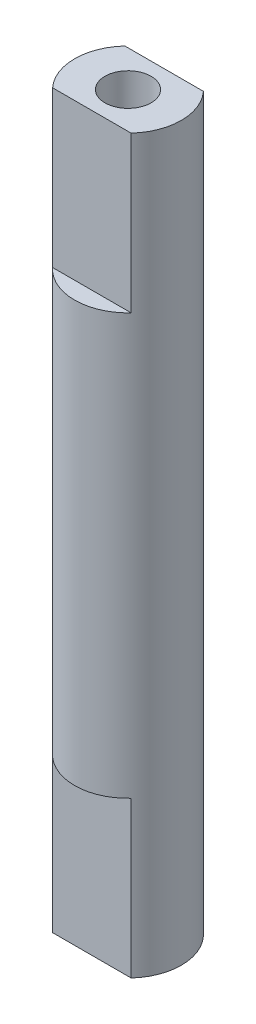
ISO-10303-21;
HEADER;
FILE_DESCRIPTION(('STEP AP214'),'2;1');
FILE_NAME('part.step','',(''),(''),'','','');
FILE_SCHEMA(('AUTOMOTIVE_DESIGN { 1 0 10303 214 1 1 1 1 }'));
ENDSEC;
DATA;
#1=APPLICATION_CONTEXT('core data for automotive mechanical design processes');
#2=APPLICATION_PROTOCOL_DEFINITION('international standard','automotive_design',2000,#1);
#3=PRODUCT_CONTEXT('',#1,'mechanical');
#4=PRODUCT('Part','Part','',(#3));
#5=PRODUCT_RELATED_PRODUCT_CATEGORY('part','',(#4));
#6=PRODUCT_DEFINITION_FORMATION('','',#4);
#7=PRODUCT_DEFINITION_CONTEXT('part definition',#1,'design');
#8=PRODUCT_DEFINITION('design','',#6,#7);
#9=PRODUCT_DEFINITION_SHAPE('','',#8);
#10=(LENGTH_UNIT() NAMED_UNIT(*) SI_UNIT(.MILLI.,.METRE.));
#11=(NAMED_UNIT(*) PLANE_ANGLE_UNIT() SI_UNIT($,.RADIAN.));
#12=(NAMED_UNIT(*) SI_UNIT($,.STERADIAN.) SOLID_ANGLE_UNIT());
#13=UNCERTAINTY_MEASURE_WITH_UNIT(LENGTH_MEASURE(1.E-05),#10,'distance_accuracy_value','');
#14=(GEOMETRIC_REPRESENTATION_CONTEXT(3) GLOBAL_UNCERTAINTY_ASSIGNED_CONTEXT((#13)) GLOBAL_UNIT_ASSIGNED_CONTEXT((#10,
#11,#12)) REPRESENTATION_CONTEXT('',''));
#15=CARTESIAN_POINT('',(0.,0.,0.));
#16=DIRECTION('',(0.,0.,1.));
#17=DIRECTION('',(1.,0.,0.));
#18=AXIS2_PLACEMENT_3D('',#15,#16,#17);
#19=CARTESIAN_POINT('',(0.,-12.75,0.));
#20=DIRECTION('',(0.,-1.,0.));
#21=DIRECTION('',(0.,0.,-1.));
#22=AXIS2_PLACEMENT_3D('',#19,#20,#21);
#23=PLANE('',#22);
#24=CARTESIAN_POINT('',(0.,-12.75,0.));
#25=DIRECTION('',(0.,1.,0.));
#26=DIRECTION('',(0.,0.,1.));
#27=AXIS2_PLACEMENT_3D('',#24,#25,#26);
#28=CIRCLE('',#27,1.18);
#29=CARTESIAN_POINT('',(0.,-12.75,1.18));
#30=VERTEX_POINT('',#29);
#31=EDGE_CURVE('E19',#30,#30,#28,.F.);
#32=ORIENTED_EDGE('',*,*,#31,.T.);
#33=EDGE_LOOP('',(#32));
#34=FACE_BOUND('',#33,.T.);
#35=ADVANCED_FACE('F16',(#34),#23,.T.);
#36=CARTESIAN_POINT('',(0.,12.75,0.));
#37=DIRECTION('',(0.,1.,0.));
#38=DIRECTION('',(0.,0.,1.));
#39=AXIS2_PLACEMENT_3D('',#36,#37,#38);
#40=PLANE('',#39);
#41=CARTESIAN_POINT('',(0.,12.75,0.));
#42=DIRECTION('',(0.,-1.,0.));
#43=DIRECTION('',(0.,0.,-1.));
#44=AXIS2_PLACEMENT_3D('',#41,#42,#43);
#45=CIRCLE('',#44,1.18);
#46=CARTESIAN_POINT('',(0.,12.75,-1.18));
#47=VERTEX_POINT('',#46);
#48=EDGE_CURVE('E87',#47,#47,#45,.F.);
#49=ORIENTED_EDGE('',*,*,#48,.T.);
#50=EDGE_LOOP('',(#49));
#51=FACE_BOUND('',#50,.T.);
#52=ADVANCED_FACE('F124',(#51),#40,.T.);
#53=CARTESIAN_POINT('',(0.,-18.71,0.));
#54=DIRECTION('',(0.,1.,0.));
#55=DIRECTION('',(0.,0.,1.));
#56=AXIS2_PLACEMENT_3D('',#53,#54,#55);
#57=CYLINDRICAL_SURFACE('',#56,1.18);
#58=ORIENTED_EDGE('',*,*,#31,.F.);
#59=EDGE_LOOP('',(#58));
#60=FACE_BOUND('',#59,.T.);
#61=CARTESIAN_POINT('',(0.,-18.71,0.));
#62=DIRECTION('',(0.,1.,0.));
#63=DIRECTION('',(0.,0.,1.));
#64=AXIS2_PLACEMENT_3D('',#61,#62,#63);
#65=CIRCLE('',#64,1.18);
#66=CARTESIAN_POINT('',(0.,-18.71,1.18));
#67=VERTEX_POINT('',#66);
#68=EDGE_CURVE('E109',#67,#67,#65,.F.);
#69=ORIENTED_EDGE('',*,*,#68,.T.);
#70=EDGE_LOOP('',(#69));
#71=FACE_BOUND('',#70,.T.);
#72=ADVANCED_FACE('F120',(#60,#71),#57,.F.);
#73=CARTESIAN_POINT('',(0.,18.71,0.));
#74=DIRECTION('',(0.,-1.,0.));
#75=DIRECTION('',(0.,0.,-1.));
#76=AXIS2_PLACEMENT_3D('',#73,#74,#75);
#77=CYLINDRICAL_SURFACE('',#76,1.18);
#78=ORIENTED_EDGE('',*,*,#48,.F.);
#79=EDGE_LOOP('',(#78));
#80=FACE_BOUND('',#79,.T.);
#81=CARTESIAN_POINT('',(0.,18.71,0.));
#82=DIRECTION('',(0.,-1.,0.));
#83=DIRECTION('',(0.,0.,-1.));
#84=AXIS2_PLACEMENT_3D('',#81,#82,#83);
#85=CIRCLE('',#84,1.18);
#86=CARTESIAN_POINT('',(0.,18.71,-1.18));
#87=VERTEX_POINT('',#86);
#88=EDGE_CURVE('E102',#87,#87,#85,.T.);
#89=ORIENTED_EDGE('',*,*,#88,.F.);
#90=EDGE_LOOP('',(#89));
#91=FACE_BOUND('',#90,.T.);
#92=ADVANCED_FACE('F123',(#80,#91),#77,.F.);
#93=CARTESIAN_POINT('',(0.,10.75,2.28999921925296));
#94=DIRECTION('',(0.,1.,0.));
#95=DIRECTION('',(0.,0.,1.));
#96=AXIS2_PLACEMENT_3D('',#93,#94,#95);
#97=PLANE('',#96);
#98=CARTESIAN_POINT('',(0.,10.75,0.));
#99=DIRECTION('',(0.,1.,0.));
#100=DIRECTION('',(0.,0.,1.));
#101=AXIS2_PLACEMENT_3D('',#98,#99,#100);
#102=CIRCLE('',#101,2.73);
#103=CARTESIAN_POINT('',(2.00758672314726,10.75,1.84999879703815));
#104=VERTEX_POINT('',#103);
#105=CARTESIAN_POINT('',(-2.00758672314726,10.75,1.84999879703815));
#106=VERTEX_POINT('',#105);
#107=EDGE_CURVE('E84',#104,#106,#102,.F.);
#108=ORIENTED_EDGE('',*,*,#107,.F.);
#109=DIRECTION('',(-1.,0.,0.));
#110=VECTOR('',#109,1.);
#111=CARTESIAN_POINT('',(-2.00758561461274,10.75,1.84999843850591));
#112=LINE('',#111,#110);
#113=EDGE_CURVE('E79',#104,#106,#112,.T.);
#114=ORIENTED_EDGE('',*,*,#113,.T.);
#115=EDGE_LOOP('',(#108,#114));
#116=FACE_BOUND('',#115,.T.);
#117=ADVANCED_FACE('F82',(#116),#97,.T.);
#118=CARTESIAN_POINT('',(-2.00758561461274,18.71,1.84999843850591));
#119=DIRECTION('',(0.,0.,-1.));
#120=DIRECTION('',(-1.,0.,0.));
#121=AXIS2_PLACEMENT_3D('',#118,#119,#120);
#122=PLANE('',#121);
#123=DIRECTION('',(0.,1.,0.));
#124=VECTOR('',#123,1.);
#125=CARTESIAN_POINT('',(-2.00758639275844,0.,1.84999915557039));
#126=LINE('',#125,#124);
#127=CARTESIAN_POINT('',(-2.00758672314726,18.71,1.84999879703815));
#128=VERTEX_POINT('',#127);
#129=EDGE_CURVE('E90',#106,#128,#126,.T.);
#130=ORIENTED_EDGE('',*,*,#129,.F.);
#131=ORIENTED_EDGE('',*,*,#113,.F.);
#132=DIRECTION('',(0.,1.,0.));
#133=VECTOR('',#132,1.);
#134=CARTESIAN_POINT('',(2.00758639275844,0.,1.84999915557039));
#135=LINE('',#134,#133);
#136=CARTESIAN_POINT('',(2.00758672314726,18.71,1.84999879703815));
#137=VERTEX_POINT('',#136);
#138=EDGE_CURVE('E100',#137,#104,#135,.F.);
#139=ORIENTED_EDGE('',*,*,#138,.F.);
#140=DIRECTION('',(1.,0.,0.));
#141=VECTOR('',#140,1.);
#142=CARTESIAN_POINT('',(0.,18.71,1.84999843850591));
#143=LINE('',#142,#141);
#144=EDGE_CURVE('E93',#128,#137,#143,.T.);
#145=ORIENTED_EDGE('',*,*,#144,.F.);
#146=EDGE_LOOP('',(#130,#131,#139,#145));
#147=FACE_BOUND('',#146,.T.);
#148=ADVANCED_FACE('F91',(#147),#122,.F.);
#149=CARTESIAN_POINT('',(0.,-10.75,0.));
#150=DIRECTION('',(0.,-1.,0.));
#151=DIRECTION('',(0.,0.,-1.));
#152=AXIS2_PLACEMENT_3D('',#149,#150,#151);
#153=PLANE('',#152);
#154=DIRECTION('',(-1.,0.,0.));
#155=VECTOR('',#154,1.);
#156=CARTESIAN_POINT('',(2.00758561461274,-10.75,1.84999843850591));
#157=LINE('',#156,#155);
#158=CARTESIAN_POINT('',(-2.00758672314726,-10.75,1.84999879703815));
#159=VERTEX_POINT('',#158);
#160=CARTESIAN_POINT('',(2.00758672314726,-10.75,1.84999879703815));
#161=VERTEX_POINT('',#160);
#162=EDGE_CURVE('E86',#159,#161,#157,.F.);
#163=ORIENTED_EDGE('',*,*,#162,.T.);
#164=CARTESIAN_POINT('',(0.,-10.75,0.));
#165=DIRECTION('',(0.,1.,0.));
#166=DIRECTION('',(0.,0.,1.));
#167=AXIS2_PLACEMENT_3D('',#164,#165,#166);
#168=CIRCLE('',#167,2.73);
#169=EDGE_CURVE('E152',#159,#161,#168,.T.);
#170=ORIENTED_EDGE('',*,*,#169,.F.);
#171=EDGE_LOOP('',(#163,#170));
#172=FACE_BOUND('',#171,.T.);
#173=ADVANCED_FACE('F260',(#172),#153,.T.);
#174=CARTESIAN_POINT('',(2.00758561461274,-18.71,1.84999843850591));
#175=DIRECTION('',(0.,0.,-1.));
#176=DIRECTION('',(-1.,0.,0.));
#177=AXIS2_PLACEMENT_3D('',#174,#175,#176);
#178=PLANE('',#177);
#179=DIRECTION('',(0.,1.,0.));
#180=VECTOR('',#179,1.);
#181=CARTESIAN_POINT('',(2.00758639275844,0.,1.84999915557039));
#182=LINE('',#181,#180);
#183=CARTESIAN_POINT('',(2.00758672314726,-18.71,1.84999879703815));
#184=VERTEX_POINT('',#183);
#185=EDGE_CURVE('E145',#161,#184,#182,.F.);
#186=ORIENTED_EDGE('',*,*,#185,.F.);
#187=ORIENTED_EDGE('',*,*,#162,.F.);
#188=DIRECTION('',(0.,1.,0.));
#189=VECTOR('',#188,1.);
#190=CARTESIAN_POINT('',(-2.00758639275844,0.,1.84999915557039));
#191=LINE('',#190,#189);
#192=CARTESIAN_POINT('',(-2.00758672314726,-18.71,1.84999879703815));
#193=VERTEX_POINT('',#192);
#194=EDGE_CURVE('E155',#193,#159,#191,.T.);
#195=ORIENTED_EDGE('',*,*,#194,.F.);
#196=DIRECTION('',(1.,0.,0.));
#197=VECTOR('',#196,1.);
#198=CARTESIAN_POINT('',(0.,-18.71,1.84999843850591));
#199=LINE('',#198,#197);
#200=EDGE_CURVE('E138',#193,#184,#199,.T.);
#201=ORIENTED_EDGE('',*,*,#200,.T.);
#202=EDGE_LOOP('',(#186,#187,#195,#201));
#203=FACE_BOUND('',#202,.T.);
#204=ADVANCED_FACE('F194',(#203),#178,.F.);
#205=CARTESIAN_POINT('',(0.,-10.75,0.));
#206=DIRECTION('',(0.,-1.,0.));
#207=DIRECTION('',(0.,0.,-1.));
#208=AXIS2_PLACEMENT_3D('',#205,#206,#207);
#209=PLANE('',#208);
#210=CARTESIAN_POINT('',(0.,-10.75,0.));
#211=DIRECTION('',(0.,1.,0.));
#212=DIRECTION('',(0.,0.,1.));
#213=AXIS2_PLACEMENT_3D('',#210,#211,#212);
#214=CIRCLE('',#213,2.73);
#215=CARTESIAN_POINT('',(2.00758561461274,-10.75,-1.85));
#216=VERTEX_POINT('',#215);
#217=CARTESIAN_POINT('',(-2.00758561461274,-10.75,-1.85));
#218=VERTEX_POINT('',#217);
#219=EDGE_CURVE('E168',#216,#218,#214,.T.);
#220=ORIENTED_EDGE('',*,*,#219,.F.);
#221=DIRECTION('',(1.,0.,0.));
#222=VECTOR('',#221,1.);
#223=CARTESIAN_POINT('',(-2.00758561461274,-10.75,-1.85));
#224=LINE('',#223,#222);
#225=EDGE_CURVE('E161',#216,#218,#224,.F.);
#226=ORIENTED_EDGE('',*,*,#225,.T.);
#227=EDGE_LOOP('',(#220,#226));
#228=FACE_BOUND('',#227,.T.);
#229=ADVANCED_FACE('F186',(#228),#209,.T.);
#230=CARTESIAN_POINT('',(-2.00758561461274,-18.71,-1.85));
#231=DIRECTION('',(0.,0.,1.));
#232=DIRECTION('',(1.,0.,0.));
#233=AXIS2_PLACEMENT_3D('',#230,#231,#232);
#234=PLANE('',#233);
#235=DIRECTION('',(0.,1.,0.));
#236=VECTOR('',#235,1.);
#237=CARTESIAN_POINT('',(-2.00758561461274,0.,-1.85));
#238=LINE('',#237,#236);
#239=CARTESIAN_POINT('',(-2.00758561461274,-18.71,-1.85));
#240=VERTEX_POINT('',#239);
#241=EDGE_CURVE('E170',#218,#240,#238,.F.);
#242=ORIENTED_EDGE('',*,*,#241,.F.);
#243=ORIENTED_EDGE('',*,*,#225,.F.);
#244=DIRECTION('',(0.,1.,0.));
#245=VECTOR('',#244,1.);
#246=CARTESIAN_POINT('',(2.00758561461274,0.,-1.85));
#247=LINE('',#246,#245);
#248=CARTESIAN_POINT('',(2.00758561461274,-18.71,-1.85));
#249=VERTEX_POINT('',#248);
#250=EDGE_CURVE('E144',#249,#216,#247,.T.);
#251=ORIENTED_EDGE('',*,*,#250,.F.);
#252=DIRECTION('',(1.,0.,0.));
#253=VECTOR('',#252,1.);
#254=CARTESIAN_POINT('',(0.,-18.71,-1.85));
#255=LINE('',#254,#253);
#256=EDGE_CURVE('E112',#249,#240,#255,.F.);
#257=ORIENTED_EDGE('',*,*,#256,.T.);
#258=EDGE_LOOP('',(#242,#243,#251,#257));
#259=FACE_BOUND('',#258,.T.);
#260=ADVANCED_FACE('F132',(#259),#234,.F.);
#261=CARTESIAN_POINT('',(0.,-18.71,0.));
#262=DIRECTION('',(0.,1.,0.));
#263=DIRECTION('',(0.,0.,1.));
#264=AXIS2_PLACEMENT_3D('',#261,#262,#263);
#265=PLANE('',#264);
#266=ORIENTED_EDGE('',*,*,#68,.F.);
#267=EDGE_LOOP('',(#266));
#268=FACE_BOUND('',#267,.T.);
#269=CARTESIAN_POINT('',(0.,-18.71,0.));
#270=DIRECTION('',(0.,1.,0.));
#271=DIRECTION('',(0.,0.,1.));
#272=AXIS2_PLACEMENT_3D('',#269,#270,#271);
#273=CIRCLE('',#272,2.73);
#274=EDGE_CURVE('E136',#184,#249,#273,.T.);
#275=ORIENTED_EDGE('',*,*,#274,.F.);
#276=ORIENTED_EDGE('',*,*,#200,.F.);
#277=CARTESIAN_POINT('',(0.,-18.71,0.));
#278=DIRECTION('',(0.,1.,0.));
#279=DIRECTION('',(0.,0.,1.));
#280=AXIS2_PLACEMENT_3D('',#277,#278,#279);
#281=CIRCLE('',#280,2.73);
#282=EDGE_CURVE('E162',#240,#193,#281,.T.);
#283=ORIENTED_EDGE('',*,*,#282,.F.);
#284=ORIENTED_EDGE('',*,*,#256,.F.);
#285=EDGE_LOOP('',(#275,#276,#283,#284));
#286=FACE_BOUND('',#285,.T.);
#287=ADVANCED_FACE('F128',(#268,#286),#265,.F.);
#288=CARTESIAN_POINT('',(0.,10.75,-2.29));
#289=DIRECTION('',(0.,1.,0.));
#290=DIRECTION('',(0.,0.,1.));
#291=AXIS2_PLACEMENT_3D('',#288,#289,#290);
#292=PLANE('',#291);
#293=DIRECTION('',(1.,0.,0.));
#294=VECTOR('',#293,1.);
#295=CARTESIAN_POINT('',(2.00758561461274,10.75,-1.85));
#296=LINE('',#295,#294);
#297=CARTESIAN_POINT('',(-2.00758561461274,10.75,-1.85));
#298=VERTEX_POINT('',#297);
#299=CARTESIAN_POINT('',(2.00758561461274,10.75,-1.85));
#300=VERTEX_POINT('',#299);
#301=EDGE_CURVE('E111',#298,#300,#296,.T.);
#302=ORIENTED_EDGE('',*,*,#301,.T.);
#303=CARTESIAN_POINT('',(0.,10.75,0.));
#304=DIRECTION('',(0.,1.,0.));
#305=DIRECTION('',(0.,0.,1.));
#306=AXIS2_PLACEMENT_3D('',#303,#304,#305);
#307=CIRCLE('',#306,2.73);
#308=EDGE_CURVE('E164',#298,#300,#307,.F.);
#309=ORIENTED_EDGE('',*,*,#308,.F.);
#310=EDGE_LOOP('',(#302,#309));
#311=FACE_BOUND('',#310,.T.);
#312=ADVANCED_FACE('F131',(#311),#292,.T.);
#313=CARTESIAN_POINT('',(2.00758561461274,18.71,-1.85));
#314=DIRECTION('',(0.,0.,1.));
#315=DIRECTION('',(1.,0.,0.));
#316=AXIS2_PLACEMENT_3D('',#313,#314,#315);
#317=PLANE('',#316);
#318=DIRECTION('',(0.,1.,0.));
#319=VECTOR('',#318,1.);
#320=CARTESIAN_POINT('',(2.00758561461274,0.,-1.85));
#321=LINE('',#320,#319);
#322=CARTESIAN_POINT('',(2.00758561461274,18.71,-1.85));
#323=VERTEX_POINT('',#322);
#324=EDGE_CURVE('E25',#300,#323,#321,.T.);
#325=ORIENTED_EDGE('',*,*,#324,.F.);
#326=ORIENTED_EDGE('',*,*,#301,.F.);
#327=DIRECTION('',(0.,1.,0.));
#328=VECTOR('',#327,1.);
#329=CARTESIAN_POINT('',(-2.00758561461274,0.,-1.85));
#330=LINE('',#329,#328);
#331=CARTESIAN_POINT('',(-2.00758561461274,18.71,-1.85));
#332=VERTEX_POINT('',#331);
#333=EDGE_CURVE('E167',#332,#298,#330,.F.);
#334=ORIENTED_EDGE('',*,*,#333,.F.);
#335=DIRECTION('',(1.,0.,0.));
#336=VECTOR('',#335,1.);
#337=CARTESIAN_POINT('',(0.,18.71,-1.85));
#338=LINE('',#337,#336);
#339=EDGE_CURVE('E34',#323,#332,#338,.F.);
#340=ORIENTED_EDGE('',*,*,#339,.F.);
#341=EDGE_LOOP('',(#325,#326,#334,#340));
#342=FACE_BOUND('',#341,.T.);
#343=ADVANCED_FACE('F176',(#342),#317,.F.);
#344=CARTESIAN_POINT('',(0.,18.71,0.));
#345=DIRECTION('',(0.,1.,0.));
#346=DIRECTION('',(0.,0.,1.));
#347=AXIS2_PLACEMENT_3D('',#344,#345,#346);
#348=PLANE('',#347);
#349=ORIENTED_EDGE('',*,*,#88,.T.);
#350=EDGE_LOOP('',(#349));
#351=FACE_BOUND('',#350,.T.);
#352=ORIENTED_EDGE('',*,*,#339,.T.);
#353=CARTESIAN_POINT('',(0.,18.71,0.));
#354=DIRECTION('',(0.,1.,0.));
#355=DIRECTION('',(0.,0.,1.));
#356=AXIS2_PLACEMENT_3D('',#353,#354,#355);
#357=CIRCLE('',#356,2.73);
#358=EDGE_CURVE('E96',#128,#332,#357,.F.);
#359=ORIENTED_EDGE('',*,*,#358,.F.);
#360=ORIENTED_EDGE('',*,*,#144,.T.);
#361=CARTESIAN_POINT('',(0.,18.71,0.));
#362=DIRECTION('',(0.,1.,0.));
#363=DIRECTION('',(0.,0.,1.));
#364=AXIS2_PLACEMENT_3D('',#361,#362,#363);
#365=CIRCLE('',#364,2.73);
#366=EDGE_CURVE('E11',#323,#137,#365,.F.);
#367=ORIENTED_EDGE('',*,*,#366,.F.);
#368=EDGE_LOOP('',(#352,#359,#360,#367));
#369=FACE_BOUND('',#368,.T.);
#370=ADVANCED_FACE('F174',(#351,#369),#348,.T.);
#371=CARTESIAN_POINT('',(0.,0.,0.));
#372=DIRECTION('',(0.,1.,0.));
#373=DIRECTION('',(0.,0.,1.));
#374=AXIS2_PLACEMENT_3D('',#371,#372,#373);
#375=CYLINDRICAL_SURFACE('',#374,2.73);
#376=ORIENTED_EDGE('',*,*,#241,.T.);
#377=ORIENTED_EDGE('',*,*,#282,.T.);
#378=ORIENTED_EDGE('',*,*,#194,.T.);
#379=ORIENTED_EDGE('',*,*,#169,.T.);
#380=ORIENTED_EDGE('',*,*,#185,.T.);
#381=ORIENTED_EDGE('',*,*,#274,.T.);
#382=ORIENTED_EDGE('',*,*,#250,.T.);
#383=ORIENTED_EDGE('',*,*,#219,.T.);
#384=EDGE_LOOP('',(#376,#377,#378,#379,#380,#381,#382,#383));
#385=FACE_BOUND('',#384,.T.);
#386=ORIENTED_EDGE('',*,*,#324,.T.);
#387=ORIENTED_EDGE('',*,*,#366,.T.);
#388=ORIENTED_EDGE('',*,*,#138,.T.);
#389=ORIENTED_EDGE('',*,*,#107,.T.);
#390=ORIENTED_EDGE('',*,*,#129,.T.);
#391=ORIENTED_EDGE('',*,*,#358,.T.);
#392=ORIENTED_EDGE('',*,*,#333,.T.);
#393=ORIENTED_EDGE('',*,*,#308,.T.);
#394=EDGE_LOOP('',(#386,#387,#388,#389,#390,#391,#392,#393));
#395=FACE_BOUND('',#394,.T.);
#396=ADVANCED_FACE('F99',(#385,#395),#375,.T.);
#397=CLOSED_SHELL('',(#35,#52,#72,#92,#117,#148,#173,#204,#229,#260,#287,#312,#343,#370,#396));
#398=MANIFOLD_SOLID_BREP('B1',#397);
#399=ADVANCED_BREP_SHAPE_REPRESENTATION('',(#18,#398),#14);
#400=SHAPE_DEFINITION_REPRESENTATION(#9,#399);
ENDSEC;
END-ISO-10303-21;
